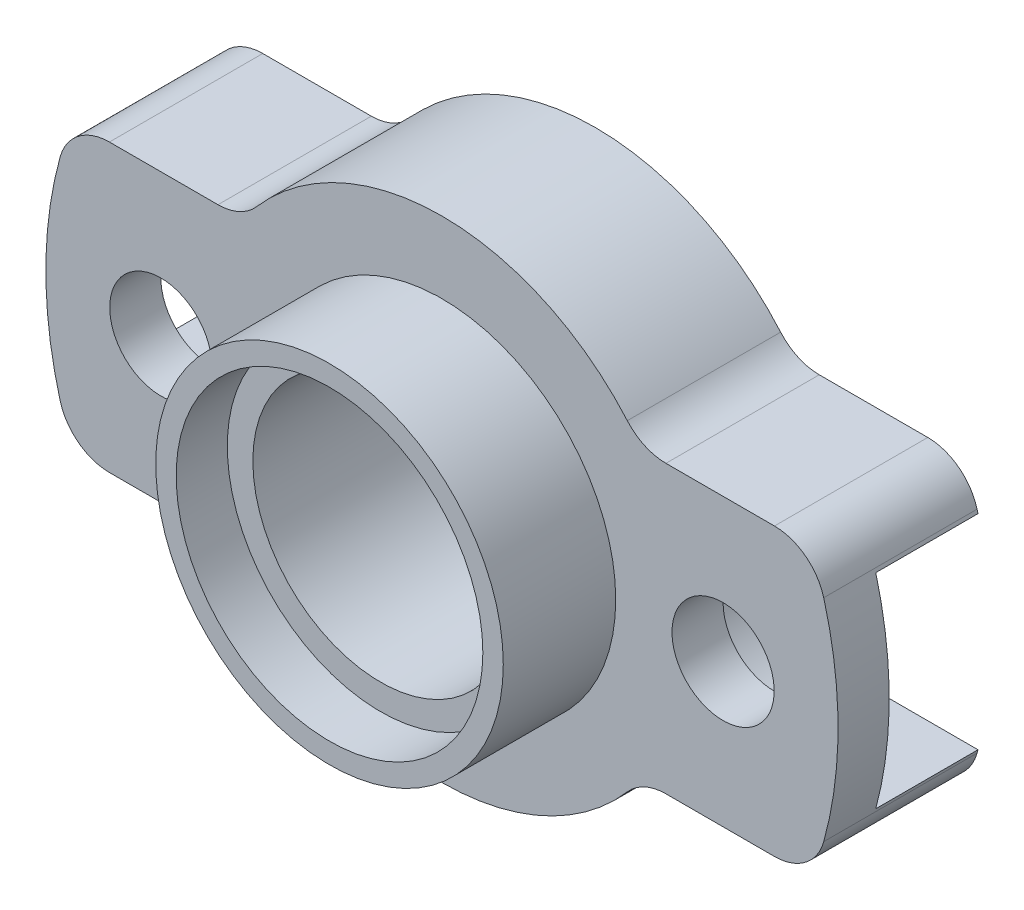
ISO-10303-21;
HEADER;
FILE_DESCRIPTION(('STEP AP214'),'2;1');
FILE_NAME('part.step','',(''),(''),'','','');
FILE_SCHEMA(('AUTOMOTIVE_DESIGN { 1 0 10303 214 1 1 1 1 }'));
ENDSEC;
DATA;
#1=APPLICATION_CONTEXT('core data for automotive mechanical design processes');
#2=APPLICATION_PROTOCOL_DEFINITION('international standard','automotive_design',2000,#1);
#3=PRODUCT_CONTEXT('',#1,'mechanical');
#4=PRODUCT('Part','Part','',(#3));
#5=PRODUCT_RELATED_PRODUCT_CATEGORY('part','',(#4));
#6=PRODUCT_DEFINITION_FORMATION('','',#4);
#7=PRODUCT_DEFINITION_CONTEXT('part definition',#1,'design');
#8=PRODUCT_DEFINITION('design','',#6,#7);
#9=PRODUCT_DEFINITION_SHAPE('','',#8);
#10=(LENGTH_UNIT() NAMED_UNIT(*) SI_UNIT(.MILLI.,.METRE.));
#11=(NAMED_UNIT(*) PLANE_ANGLE_UNIT() SI_UNIT($,.RADIAN.));
#12=(NAMED_UNIT(*) SI_UNIT($,.STERADIAN.) SOLID_ANGLE_UNIT());
#13=UNCERTAINTY_MEASURE_WITH_UNIT(LENGTH_MEASURE(1.E-05),#10,'distance_accuracy_value','');
#14=(GEOMETRIC_REPRESENTATION_CONTEXT(3) GLOBAL_UNCERTAINTY_ASSIGNED_CONTEXT((#13)) GLOBAL_UNIT_ASSIGNED_CONTEXT((#10,
#11,#12)) REPRESENTATION_CONTEXT('',''));
#15=CARTESIAN_POINT('',(0.,0.,0.));
#16=DIRECTION('',(0.,0.,1.));
#17=DIRECTION('',(1.,0.,0.));
#18=AXIS2_PLACEMENT_3D('',#15,#16,#17);
#19=CARTESIAN_POINT('',(0.,0.,3.));
#20=DIRECTION('',(0.,0.,-1.));
#21=DIRECTION('',(-1.,0.,0.));
#22=AXIS2_PLACEMENT_3D('',#19,#20,#21);
#23=CYLINDRICAL_SURFACE('',#22,2.5);
#24=CARTESIAN_POINT('',(0.,0.,0.));
#25=DIRECTION('',(0.,0.,1.));
#26=DIRECTION('',(1.,0.,0.));
#27=AXIS2_PLACEMENT_3D('',#24,#25,#26);
#28=CIRCLE('',#27,2.5);
#29=CARTESIAN_POINT('',(2.5,0.,0.));
#30=VERTEX_POINT('',#29);
#31=EDGE_CURVE('E309',#30,#30,#28,.T.);
#32=ORIENTED_EDGE('',*,*,#31,.F.);
#33=EDGE_LOOP('',(#32));
#34=FACE_BOUND('',#33,.T.);
#35=CARTESIAN_POINT('',(0.,0.,4.2));
#36=DIRECTION('',(0.,0.,1.));
#37=DIRECTION('',(1.,0.,0.));
#38=AXIS2_PLACEMENT_3D('',#35,#36,#37);
#39=CIRCLE('',#38,2.5);
#40=CARTESIAN_POINT('',(2.5,0.,4.2));
#41=VERTEX_POINT('',#40);
#42=EDGE_CURVE('E45',#41,#41,#39,.T.);
#43=ORIENTED_EDGE('',*,*,#42,.T.);
#44=EDGE_LOOP('',(#43));
#45=FACE_BOUND('',#44,.T.);
#46=ADVANCED_FACE('F41',(#34,#45),#23,.F.);
#47=CARTESIAN_POINT('',(5.5,0.,3.));
#48=DIRECTION('',(0.,0.,-1.));
#49=DIRECTION('',(-1.,0.,0.));
#50=AXIS2_PLACEMENT_3D('',#47,#48,#49);
#51=CYLINDRICAL_SURFACE('',#50,1.);
#52=CARTESIAN_POINT('',(5.5,0.,3.));
#53=DIRECTION('',(0.,0.,1.));
#54=DIRECTION('',(-1.,0.,0.));
#55=AXIS2_PLACEMENT_3D('',#52,#53,#54);
#56=CIRCLE('',#55,1.);
#57=CARTESIAN_POINT('',(4.5,0.,3.));
#58=VERTEX_POINT('',#57);
#59=EDGE_CURVE('E296',#58,#58,#56,.T.);
#60=ORIENTED_EDGE('',*,*,#59,.T.);
#61=EDGE_LOOP('',(#60));
#62=FACE_BOUND('',#61,.T.);
#63=CARTESIAN_POINT('',(5.5,0.,2.));
#64=DIRECTION('',(0.,0.,-1.));
#65=DIRECTION('',(-1.,0.,0.));
#66=AXIS2_PLACEMENT_3D('',#63,#64,#65);
#67=CIRCLE('',#66,1.);
#68=CARTESIAN_POINT('',(4.5,0.,2.));
#69=VERTEX_POINT('',#68);
#70=EDGE_CURVE('E251',#69,#69,#67,.T.);
#71=ORIENTED_EDGE('',*,*,#70,.T.);
#72=EDGE_LOOP('',(#71));
#73=FACE_BOUND('',#72,.T.);
#74=ADVANCED_FACE('F494',(#62,#73),#51,.F.);
#75=CARTESIAN_POINT('',(6.50557453266043,-1.8,3.));
#76=DIRECTION('',(0.,0.,1.));
#77=DIRECTION('',(1.,0.,0.));
#78=AXIS2_PLACEMENT_3D('',#75,#76,#77);
#79=PLANE('',#78);
#80=ORIENTED_EDGE('',*,*,#59,.F.);
#81=EDGE_LOOP('',(#80));
#82=FACE_BOUND('',#81,.T.);
#83=CARTESIAN_POINT('',(6.50557453266043,-1.8,3.));
#84=DIRECTION('',(0.,0.,1.));
#85=DIRECTION('',(1.,0.,0.));
#86=AXIS2_PLACEMENT_3D('',#83,#84,#85);
#87=CIRCLE('',#86,1.);
#88=CARTESIAN_POINT('',(6.50557453266043,-2.8,3.));
#89=VERTEX_POINT('',#88);
#90=CARTESIAN_POINT('',(7.46936335231383,-2.06666666666667,3.));
#91=VERTEX_POINT('',#90);
#92=EDGE_CURVE('E314',#89,#91,#87,.T.);
#93=ORIENTED_EDGE('',*,*,#92,.T.);
#94=CARTESIAN_POINT('',(0.,0.,3.));
#95=DIRECTION('',(0.,0.,1.));
#96=DIRECTION('',(1.,0.,0.));
#97=AXIS2_PLACEMENT_3D('',#94,#95,#96);
#98=CIRCLE('',#97,7.75);
#99=CARTESIAN_POINT('',(7.46936335231383,2.06666666666667,3.));
#100=VERTEX_POINT('',#99);
#101=EDGE_CURVE('E318',#91,#100,#98,.T.);
#102=ORIENTED_EDGE('',*,*,#101,.T.);
#103=CARTESIAN_POINT('',(6.50557453266043,1.8,3.));
#104=DIRECTION('',(0.,0.,1.));
#105=DIRECTION('',(-1.,0.,0.));
#106=AXIS2_PLACEMENT_3D('',#103,#104,#105);
#107=CIRCLE('',#106,1.);
#108=CARTESIAN_POINT('',(6.50557453266043,2.8,3.));
#109=VERTEX_POINT('',#108);
#110=EDGE_CURVE('E322',#100,#109,#107,.T.);
#111=ORIENTED_EDGE('',*,*,#110,.T.);
#112=DIRECTION('',(-1.,0.,0.));
#113=VECTOR('',#112,1.);
#114=CARTESIAN_POINT('',(6.50557453266043,2.8,3.));
#115=LINE('',#114,#113);
#116=CARTESIAN_POINT('',(4.38178046004133,2.8,3.));
#117=VERTEX_POINT('',#116);
#118=EDGE_CURVE('E325',#109,#117,#115,.T.);
#119=ORIENTED_EDGE('',*,*,#118,.T.);
#120=CARTESIAN_POINT('',(4.38178046004133,3.8,3.));
#121=DIRECTION('',(0.,0.,-1.));
#122=DIRECTION('',(-1.,0.,0.));
#123=AXIS2_PLACEMENT_3D('',#120,#121,#122);
#124=CIRCLE('',#123,1.);
#125=CARTESIAN_POINT('',(3.62630107037903,3.1448275862069,3.));
#126=VERTEX_POINT('',#125);
#127=EDGE_CURVE('E328',#117,#126,#124,.T.);
#128=ORIENTED_EDGE('',*,*,#127,.T.);
#129=CARTESIAN_POINT('',(0.,0.,3.));
#130=DIRECTION('',(0.,0.,1.));
#131=DIRECTION('',(1.,0.,0.));
#132=AXIS2_PLACEMENT_3D('',#129,#130,#131);
#133=CIRCLE('',#132,4.8);
#134=CARTESIAN_POINT('',(-3.62630107037903,3.1448275862069,3.));
#135=VERTEX_POINT('',#134);
#136=EDGE_CURVE('E331',#126,#135,#133,.T.);
#137=ORIENTED_EDGE('',*,*,#136,.T.);
#138=CARTESIAN_POINT('',(-4.38178046004133,3.8,3.));
#139=DIRECTION('',(0.,0.,-1.));
#140=DIRECTION('',(1.,0.,0.));
#141=AXIS2_PLACEMENT_3D('',#138,#139,#140);
#142=CIRCLE('',#141,1.);
#143=CARTESIAN_POINT('',(-4.38178046004133,2.8,3.));
#144=VERTEX_POINT('',#143);
#145=EDGE_CURVE('E334',#135,#144,#142,.T.);
#146=ORIENTED_EDGE('',*,*,#145,.T.);
#147=DIRECTION('',(-1.,0.,0.));
#148=VECTOR('',#147,1.);
#149=CARTESIAN_POINT('',(-6.50557453266043,2.8,3.));
#150=LINE('',#149,#148);
#151=CARTESIAN_POINT('',(-6.50557453266043,2.8,3.));
#152=VERTEX_POINT('',#151);
#153=EDGE_CURVE('E337',#144,#152,#150,.T.);
#154=ORIENTED_EDGE('',*,*,#153,.T.);
#155=CARTESIAN_POINT('',(-6.50557453266043,1.8,3.));
#156=DIRECTION('',(0.,0.,1.));
#157=DIRECTION('',(1.,0.,0.));
#158=AXIS2_PLACEMENT_3D('',#155,#156,#157);
#159=CIRCLE('',#158,1.);
#160=CARTESIAN_POINT('',(-7.46936335231383,2.06666666666667,3.));
#161=VERTEX_POINT('',#160);
#162=EDGE_CURVE('E340',#152,#161,#159,.T.);
#163=ORIENTED_EDGE('',*,*,#162,.T.);
#164=CARTESIAN_POINT('',(0.,0.,3.));
#165=DIRECTION('',(0.,0.,1.));
#166=DIRECTION('',(1.,0.,0.));
#167=AXIS2_PLACEMENT_3D('',#164,#165,#166);
#168=CIRCLE('',#167,7.75);
#169=CARTESIAN_POINT('',(-7.46936335231383,-2.06666666666667,3.));
#170=VERTEX_POINT('',#169);
#171=EDGE_CURVE('E343',#161,#170,#168,.T.);
#172=ORIENTED_EDGE('',*,*,#171,.T.);
#173=CARTESIAN_POINT('',(-6.50557453266043,-1.8,3.));
#174=DIRECTION('',(0.,0.,1.));
#175=DIRECTION('',(-1.,0.,0.));
#176=AXIS2_PLACEMENT_3D('',#173,#174,#175);
#177=CIRCLE('',#176,1.);
#178=CARTESIAN_POINT('',(-6.50557453266043,-2.8,3.));
#179=VERTEX_POINT('',#178);
#180=EDGE_CURVE('E346',#170,#179,#177,.T.);
#181=ORIENTED_EDGE('',*,*,#180,.T.);
#182=DIRECTION('',(1.,0.,0.));
#183=VECTOR('',#182,1.);
#184=CARTESIAN_POINT('',(-6.50557453266043,-2.8,3.));
#185=LINE('',#184,#183);
#186=CARTESIAN_POINT('',(-4.38178046004133,-2.8,3.));
#187=VERTEX_POINT('',#186);
#188=EDGE_CURVE('E349',#179,#187,#185,.T.);
#189=ORIENTED_EDGE('',*,*,#188,.T.);
#190=CARTESIAN_POINT('',(-4.38178046004133,-3.8,3.));
#191=DIRECTION('',(0.,0.,-1.));
#192=DIRECTION('',(-1.,0.,0.));
#193=AXIS2_PLACEMENT_3D('',#190,#191,#192);
#194=CIRCLE('',#193,1.);
#195=CARTESIAN_POINT('',(-3.62630107037903,-3.14482758620689,3.));
#196=VERTEX_POINT('',#195);
#197=EDGE_CURVE('E352',#187,#196,#194,.T.);
#198=ORIENTED_EDGE('',*,*,#197,.T.);
#199=CARTESIAN_POINT('',(0.,0.,3.));
#200=DIRECTION('',(0.,0.,1.));
#201=DIRECTION('',(1.,0.,0.));
#202=AXIS2_PLACEMENT_3D('',#199,#200,#201);
#203=CIRCLE('',#202,4.8);
#204=CARTESIAN_POINT('',(3.62630107037903,-3.1448275862069,3.));
#205=VERTEX_POINT('',#204);
#206=EDGE_CURVE('E355',#196,#205,#203,.T.);
#207=ORIENTED_EDGE('',*,*,#206,.T.);
#208=CARTESIAN_POINT('',(4.38178046004133,-3.8,3.));
#209=DIRECTION('',(0.,0.,-1.));
#210=DIRECTION('',(1.,0.,0.));
#211=AXIS2_PLACEMENT_3D('',#208,#209,#210);
#212=CIRCLE('',#211,1.);
#213=CARTESIAN_POINT('',(4.38178046004133,-2.8,3.));
#214=VERTEX_POINT('',#213);
#215=EDGE_CURVE('E358',#205,#214,#212,.T.);
#216=ORIENTED_EDGE('',*,*,#215,.T.);
#217=DIRECTION('',(1.,0.,0.));
#218=VECTOR('',#217,1.);
#219=CARTESIAN_POINT('',(6.50557453266043,-2.8,3.));
#220=LINE('',#219,#218);
#221=EDGE_CURVE('E361',#214,#89,#220,.T.);
#222=ORIENTED_EDGE('',*,*,#221,.T.);
#223=EDGE_LOOP('',(#93,#102,#111,#119,#128,#137,#146,#154,#163,#172,#181,#189,#198,#207,#216,#222));
#224=FACE_BOUND('',#223,.T.);
#225=CARTESIAN_POINT('',(-5.5,0.,3.));
#226=DIRECTION('',(0.,0.,1.));
#227=DIRECTION('',(1.,0.,0.));
#228=AXIS2_PLACEMENT_3D('',#225,#226,#227);
#229=CIRCLE('',#228,1.);
#230=CARTESIAN_POINT('',(-4.5,0.,3.));
#231=VERTEX_POINT('',#230);
#232=EDGE_CURVE('E305',#231,#231,#229,.T.);
#233=ORIENTED_EDGE('',*,*,#232,.F.);
#234=EDGE_LOOP('',(#233));
#235=FACE_BOUND('',#234,.T.);
#236=CARTESIAN_POINT('',(0.,0.,3.));
#237=DIRECTION('',(0.,0.,1.));
#238=DIRECTION('',(1.,0.,0.));
#239=AXIS2_PLACEMENT_3D('',#236,#237,#238);
#240=CIRCLE('',#239,3.4);
#241=CARTESIAN_POINT('',(3.4,0.,3.));
#242=VERTEX_POINT('',#241);
#243=EDGE_CURVE('E297',#242,#242,#240,.T.);
#244=ORIENTED_EDGE('',*,*,#243,.F.);
#245=EDGE_LOOP('',(#244));
#246=FACE_BOUND('',#245,.T.);
#247=ADVANCED_FACE('F490',(#82,#224,#235,#246),#79,.T.);
#248=CARTESIAN_POINT('',(6.50557453266043,-1.8,0.));
#249=DIRECTION('',(0.,0.,1.));
#250=DIRECTION('',(1.,0.,0.));
#251=AXIS2_PLACEMENT_3D('',#248,#249,#250);
#252=PLANE('',#251);
#253=CARTESIAN_POINT('',(5.5,0.,0.));
#254=DIRECTION('',(0.,0.,-1.));
#255=DIRECTION('',(-1.,0.,0.));
#256=AXIS2_PLACEMENT_3D('',#253,#254,#255);
#257=CIRCLE('',#256,2.);
#258=CARTESIAN_POINT('',(5.5,-2.,0.));
#259=VERTEX_POINT('',#258);
#260=CARTESIAN_POINT('',(5.5,2.,0.));
#261=VERTEX_POINT('',#260);
#262=EDGE_CURVE('E213',#259,#261,#257,.T.);
#263=ORIENTED_EDGE('',*,*,#262,.F.);
#264=DIRECTION('',(-1.,0.,0.));
#265=VECTOR('',#264,1.);
#266=CARTESIAN_POINT('',(5.5,-2.,0.));
#267=LINE('',#266,#265);
#268=CARTESIAN_POINT('',(7.48748956593597,-2.,0.));
#269=VERTEX_POINT('',#268);
#270=EDGE_CURVE('E229',#269,#259,#267,.T.);
#271=ORIENTED_EDGE('',*,*,#270,.F.);
#272=CARTESIAN_POINT('',(0.,0.,0.));
#273=DIRECTION('',(0.,0.,1.));
#274=DIRECTION('',(1.,0.,0.));
#275=AXIS2_PLACEMENT_3D('',#272,#273,#274);
#276=CIRCLE('',#275,7.75);
#277=CARTESIAN_POINT('',(7.46936335231383,-2.06666666666667,0.));
#278=VERTEX_POINT('',#277);
#279=EDGE_CURVE('E369',#278,#269,#276,.T.);
#280=ORIENTED_EDGE('',*,*,#279,.F.);
#281=CARTESIAN_POINT('',(6.50557453266043,-1.8,0.));
#282=DIRECTION('',(0.,0.,1.));
#283=DIRECTION('',(1.,0.,0.));
#284=AXIS2_PLACEMENT_3D('',#281,#282,#283);
#285=CIRCLE('',#284,1.);
#286=CARTESIAN_POINT('',(6.50557453266043,-2.8,0.));
#287=VERTEX_POINT('',#286);
#288=EDGE_CURVE('E313',#287,#278,#285,.T.);
#289=ORIENTED_EDGE('',*,*,#288,.F.);
#290=DIRECTION('',(1.,0.,0.));
#291=VECTOR('',#290,1.);
#292=CARTESIAN_POINT('',(6.50557453266043,-2.8,0.));
#293=LINE('',#292,#291);
#294=CARTESIAN_POINT('',(4.38178046004133,-2.8,0.));
#295=VERTEX_POINT('',#294);
#296=EDGE_CURVE('E319',#295,#287,#293,.T.);
#297=ORIENTED_EDGE('',*,*,#296,.F.);
#298=CARTESIAN_POINT('',(4.38178046004133,-3.8,0.));
#299=DIRECTION('',(0.,0.,-1.));
#300=DIRECTION('',(1.,0.,0.));
#301=AXIS2_PLACEMENT_3D('',#298,#299,#300);
#302=CIRCLE('',#301,1.);
#303=CARTESIAN_POINT('',(3.62630107037903,-3.1448275862069,0.));
#304=VERTEX_POINT('',#303);
#305=EDGE_CURVE('E411',#304,#295,#302,.T.);
#306=ORIENTED_EDGE('',*,*,#305,.F.);
#307=CARTESIAN_POINT('',(0.,0.,0.));
#308=DIRECTION('',(0.,0.,1.));
#309=DIRECTION('',(1.,0.,0.));
#310=AXIS2_PLACEMENT_3D('',#307,#308,#309);
#311=CIRCLE('',#310,4.8);
#312=CARTESIAN_POINT('',(-3.62630107037903,-3.14482758620689,0.));
#313=VERTEX_POINT('',#312);
#314=EDGE_CURVE('E408',#313,#304,#311,.T.);
#315=ORIENTED_EDGE('',*,*,#314,.F.);
#316=CARTESIAN_POINT('',(-4.38178046004133,-3.8,0.));
#317=DIRECTION('',(0.,0.,-1.));
#318=DIRECTION('',(-1.,0.,0.));
#319=AXIS2_PLACEMENT_3D('',#316,#317,#318);
#320=CIRCLE('',#319,1.);
#321=CARTESIAN_POINT('',(-4.38178046004133,-2.8,0.));
#322=VERTEX_POINT('',#321);
#323=EDGE_CURVE('E405',#322,#313,#320,.T.);
#324=ORIENTED_EDGE('',*,*,#323,.F.);
#325=DIRECTION('',(1.,0.,0.));
#326=VECTOR('',#325,1.);
#327=CARTESIAN_POINT('',(-6.50557453266043,-2.8,0.));
#328=LINE('',#327,#326);
#329=CARTESIAN_POINT('',(-6.50557453266043,-2.8,0.));
#330=VERTEX_POINT('',#329);
#331=EDGE_CURVE('E402',#330,#322,#328,.T.);
#332=ORIENTED_EDGE('',*,*,#331,.F.);
#333=CARTESIAN_POINT('',(-6.50557453266043,-1.8,0.));
#334=DIRECTION('',(0.,0.,1.));
#335=DIRECTION('',(-1.,0.,0.));
#336=AXIS2_PLACEMENT_3D('',#333,#334,#335);
#337=CIRCLE('',#336,1.);
#338=CARTESIAN_POINT('',(-7.46936335231383,-2.06666666666667,0.));
#339=VERTEX_POINT('',#338);
#340=EDGE_CURVE('E399',#339,#330,#337,.T.);
#341=ORIENTED_EDGE('',*,*,#340,.F.);
#342=CARTESIAN_POINT('',(0.,0.,0.));
#343=DIRECTION('',(0.,0.,1.));
#344=DIRECTION('',(1.,0.,0.));
#345=AXIS2_PLACEMENT_3D('',#342,#343,#344);
#346=CIRCLE('',#345,7.75);
#347=CARTESIAN_POINT('',(-7.48748956593597,-2.,0.));
#348=VERTEX_POINT('',#347);
#349=EDGE_CURVE('E394',#348,#339,#346,.T.);
#350=ORIENTED_EDGE('',*,*,#349,.F.);
#351=DIRECTION('',(-1.,0.,0.));
#352=VECTOR('',#351,1.);
#353=CARTESIAN_POINT('',(-5.5,-2.,0.));
#354=LINE('',#353,#352);
#355=CARTESIAN_POINT('',(-5.5,-2.,0.));
#356=VERTEX_POINT('',#355);
#357=EDGE_CURVE('E261',#356,#348,#354,.T.);
#358=ORIENTED_EDGE('',*,*,#357,.F.);
#359=CARTESIAN_POINT('',(-5.5,0.,0.));
#360=DIRECTION('',(0.,0.,-1.));
#361=DIRECTION('',(1.,0.,0.));
#362=AXIS2_PLACEMENT_3D('',#359,#360,#361);
#363=CIRCLE('',#362,2.);
#364=CARTESIAN_POINT('',(-5.5,2.,0.));
#365=VERTEX_POINT('',#364);
#366=EDGE_CURVE('E275',#365,#356,#363,.T.);
#367=ORIENTED_EDGE('',*,*,#366,.F.);
#368=DIRECTION('',(1.,0.,0.));
#369=VECTOR('',#368,1.);
#370=CARTESIAN_POINT('',(-5.5,2.,0.));
#371=LINE('',#370,#369);
#372=CARTESIAN_POINT('',(-7.48748956593597,2.,0.));
#373=VERTEX_POINT('',#372);
#374=EDGE_CURVE('E271',#373,#365,#371,.T.);
#375=ORIENTED_EDGE('',*,*,#374,.F.);
#376=CARTESIAN_POINT('',(-7.46936335231383,2.06666666666667,0.));
#377=VERTEX_POINT('',#376);
#378=EDGE_CURVE('E395',#377,#373,#346,.T.);
#379=ORIENTED_EDGE('',*,*,#378,.F.);
#380=CARTESIAN_POINT('',(-6.50557453266043,1.8,0.));
#381=DIRECTION('',(0.,0.,1.));
#382=DIRECTION('',(1.,0.,0.));
#383=AXIS2_PLACEMENT_3D('',#380,#381,#382);
#384=CIRCLE('',#383,1.);
#385=CARTESIAN_POINT('',(-6.50557453266043,2.8,0.));
#386=VERTEX_POINT('',#385);
#387=EDGE_CURVE('E391',#386,#377,#384,.T.);
#388=ORIENTED_EDGE('',*,*,#387,.F.);
#389=DIRECTION('',(-1.,0.,0.));
#390=VECTOR('',#389,1.);
#391=CARTESIAN_POINT('',(-6.50557453266043,2.8,0.));
#392=LINE('',#391,#390);
#393=CARTESIAN_POINT('',(-4.38178046004133,2.8,0.));
#394=VERTEX_POINT('',#393);
#395=EDGE_CURVE('E388',#394,#386,#392,.T.);
#396=ORIENTED_EDGE('',*,*,#395,.F.);
#397=CARTESIAN_POINT('',(-4.38178046004133,3.8,0.));
#398=DIRECTION('',(0.,0.,-1.));
#399=DIRECTION('',(1.,0.,0.));
#400=AXIS2_PLACEMENT_3D('',#397,#398,#399);
#401=CIRCLE('',#400,1.);
#402=CARTESIAN_POINT('',(-3.62630107037903,3.1448275862069,0.));
#403=VERTEX_POINT('',#402);
#404=EDGE_CURVE('E385',#403,#394,#401,.T.);
#405=ORIENTED_EDGE('',*,*,#404,.F.);
#406=CARTESIAN_POINT('',(0.,0.,0.));
#407=DIRECTION('',(0.,0.,1.));
#408=DIRECTION('',(1.,0.,0.));
#409=AXIS2_PLACEMENT_3D('',#406,#407,#408);
#410=CIRCLE('',#409,4.8);
#411=CARTESIAN_POINT('',(3.62630107037903,3.1448275862069,0.));
#412=VERTEX_POINT('',#411);
#413=EDGE_CURVE('E382',#412,#403,#410,.T.);
#414=ORIENTED_EDGE('',*,*,#413,.F.);
#415=CARTESIAN_POINT('',(4.38178046004133,3.8,0.));
#416=DIRECTION('',(0.,0.,-1.));
#417=DIRECTION('',(-1.,0.,0.));
#418=AXIS2_PLACEMENT_3D('',#415,#416,#417);
#419=CIRCLE('',#418,1.);
#420=CARTESIAN_POINT('',(4.38178046004133,2.8,0.));
#421=VERTEX_POINT('',#420);
#422=EDGE_CURVE('E379',#421,#412,#419,.T.);
#423=ORIENTED_EDGE('',*,*,#422,.F.);
#424=DIRECTION('',(-1.,0.,0.));
#425=VECTOR('',#424,1.);
#426=CARTESIAN_POINT('',(6.50557453266043,2.8,0.));
#427=LINE('',#426,#425);
#428=CARTESIAN_POINT('',(6.50557453266043,2.8,0.));
#429=VERTEX_POINT('',#428);
#430=EDGE_CURVE('E376',#429,#421,#427,.T.);
#431=ORIENTED_EDGE('',*,*,#430,.F.);
#432=CARTESIAN_POINT('',(6.50557453266043,1.8,0.));
#433=DIRECTION('',(0.,0.,1.));
#434=DIRECTION('',(-1.,0.,0.));
#435=AXIS2_PLACEMENT_3D('',#432,#433,#434);
#436=CIRCLE('',#435,1.);
#437=CARTESIAN_POINT('',(7.46936335231383,2.06666666666667,0.));
#438=VERTEX_POINT('',#437);
#439=EDGE_CURVE('E373',#438,#429,#436,.T.);
#440=ORIENTED_EDGE('',*,*,#439,.F.);
#441=CARTESIAN_POINT('',(7.48748956593597,2.,0.));
#442=VERTEX_POINT('',#441);
#443=EDGE_CURVE('E368',#442,#438,#276,.T.);
#444=ORIENTED_EDGE('',*,*,#443,.F.);
#445=DIRECTION('',(1.,0.,0.));
#446=VECTOR('',#445,1.);
#447=CARTESIAN_POINT('',(5.5,2.,0.));
#448=LINE('',#447,#446);
#449=EDGE_CURVE('E233',#261,#442,#448,.T.);
#450=ORIENTED_EDGE('',*,*,#449,.F.);
#451=EDGE_LOOP('',(#263,#271,#280,#289,#297,#306,#315,#324,#332,#341,#350,#358,#367,#375,#379,
#388,#396,#405,#414,#423,#431,#440,#444,#450));
#452=FACE_BOUND('',#451,.T.);
#453=ORIENTED_EDGE('',*,*,#31,.T.);
#454=EDGE_LOOP('',(#453));
#455=FACE_BOUND('',#454,.T.);
#456=ADVANCED_FACE('F493',(#452,#455),#252,.F.);
#457=CARTESIAN_POINT('',(6.50557453266043,-1.8,3.));
#458=DIRECTION('',(0.,0.,-1.));
#459=DIRECTION('',(-1.,0.,0.));
#460=AXIS2_PLACEMENT_3D('',#457,#458,#459);
#461=CYLINDRICAL_SURFACE('',#460,1.);
#462=ORIENTED_EDGE('',*,*,#288,.T.);
#463=DIRECTION('',(0.,0.,-1.));
#464=VECTOR('',#463,1.);
#465=CARTESIAN_POINT('',(7.46936335231383,-2.06666666666667,3.));
#466=LINE('',#465,#464);
#467=EDGE_CURVE('E11',#91,#278,#466,.T.);
#468=ORIENTED_EDGE('',*,*,#467,.F.);
#469=ORIENTED_EDGE('',*,*,#92,.F.);
#470=DIRECTION('',(0.,0.,-1.));
#471=VECTOR('',#470,1.);
#472=CARTESIAN_POINT('',(6.50557453266043,-2.8,3.));
#473=LINE('',#472,#471);
#474=EDGE_CURVE('E364',#89,#287,#473,.T.);
#475=ORIENTED_EDGE('',*,*,#474,.T.);
#476=EDGE_LOOP('',(#462,#468,#469,#475));
#477=FACE_BOUND('',#476,.T.);
#478=ADVANCED_FACE('F43',(#477),#461,.T.);
#479=CARTESIAN_POINT('',(0.,0.,3.));
#480=DIRECTION('',(0.,0.,-1.));
#481=DIRECTION('',(-1.,0.,0.));
#482=AXIS2_PLACEMENT_3D('',#479,#480,#481);
#483=CYLINDRICAL_SURFACE('',#482,7.75);
#484=ORIENTED_EDGE('',*,*,#279,.T.);
#485=DIRECTION('',(0.,0.,-1.));
#486=VECTOR('',#485,1.);
#487=CARTESIAN_POINT('',(7.48748956593597,-2.,2.));
#488=LINE('',#487,#486);
#489=CARTESIAN_POINT('',(7.48748956593597,-2.,2.));
#490=VERTEX_POINT('',#489);
#491=EDGE_CURVE('E252',#490,#269,#488,.T.);
#492=ORIENTED_EDGE('',*,*,#491,.F.);
#493=CARTESIAN_POINT('',(0.,0.,2.));
#494=DIRECTION('',(0.,0.,-1.));
#495=DIRECTION('',(-1.,0.,0.));
#496=AXIS2_PLACEMENT_3D('',#493,#494,#495);
#497=CIRCLE('',#496,7.75);
#498=CARTESIAN_POINT('',(7.48748956593597,2.,2.));
#499=VERTEX_POINT('',#498);
#500=EDGE_CURVE('E224',#499,#490,#497,.T.);
#501=ORIENTED_EDGE('',*,*,#500,.F.);
#502=DIRECTION('',(0.,0.,-1.));
#503=VECTOR('',#502,1.);
#504=CARTESIAN_POINT('',(7.48748956593597,2.,2.));
#505=LINE('',#504,#503);
#506=EDGE_CURVE('E217',#499,#442,#505,.T.);
#507=ORIENTED_EDGE('',*,*,#506,.T.);
#508=ORIENTED_EDGE('',*,*,#443,.T.);
#509=DIRECTION('',(0.,0.,-1.));
#510=VECTOR('',#509,1.);
#511=CARTESIAN_POINT('',(7.46936335231383,2.06666666666667,3.));
#512=LINE('',#511,#510);
#513=EDGE_CURVE('E51',#100,#438,#512,.T.);
#514=ORIENTED_EDGE('',*,*,#513,.F.);
#515=ORIENTED_EDGE('',*,*,#101,.F.);
#516=ORIENTED_EDGE('',*,*,#467,.T.);
#517=EDGE_LOOP('',(#484,#492,#501,#507,#508,#514,#515,#516));
#518=FACE_BOUND('',#517,.T.);
#519=ADVANCED_FACE('F579',(#518),#483,.T.);
#520=CARTESIAN_POINT('',(6.50557453266043,1.8,3.));
#521=DIRECTION('',(0.,0.,-1.));
#522=DIRECTION('',(-1.,0.,0.));
#523=AXIS2_PLACEMENT_3D('',#520,#521,#522);
#524=CYLINDRICAL_SURFACE('',#523,1.);
#525=ORIENTED_EDGE('',*,*,#439,.T.);
#526=DIRECTION('',(0.,0.,-1.));
#527=VECTOR('',#526,1.);
#528=CARTESIAN_POINT('',(6.50557453266043,2.8,3.));
#529=LINE('',#528,#527);
#530=EDGE_CURVE('E467',#109,#429,#529,.T.);
#531=ORIENTED_EDGE('',*,*,#530,.F.);
#532=ORIENTED_EDGE('',*,*,#110,.F.);
#533=ORIENTED_EDGE('',*,*,#513,.T.);
#534=EDGE_LOOP('',(#525,#531,#532,#533));
#535=FACE_BOUND('',#534,.T.);
#536=ADVANCED_FACE('F576',(#535),#524,.T.);
#537=CARTESIAN_POINT('',(6.50557453266043,2.8,3.));
#538=DIRECTION('',(0.,-1.,0.));
#539=DIRECTION('',(0.,0.,-1.));
#540=AXIS2_PLACEMENT_3D('',#537,#538,#539);
#541=PLANE('',#540);
#542=ORIENTED_EDGE('',*,*,#430,.T.);
#543=DIRECTION('',(0.,0.,-1.));
#544=VECTOR('',#543,1.);
#545=CARTESIAN_POINT('',(4.38178046004133,2.8,3.));
#546=LINE('',#545,#544);
#547=EDGE_CURVE('E463',#117,#421,#546,.T.);
#548=ORIENTED_EDGE('',*,*,#547,.F.);
#549=ORIENTED_EDGE('',*,*,#118,.F.);
#550=ORIENTED_EDGE('',*,*,#530,.T.);
#551=EDGE_LOOP('',(#542,#548,#549,#550));
#552=FACE_BOUND('',#551,.T.);
#553=ADVANCED_FACE('F572',(#552),#541,.F.);
#554=CARTESIAN_POINT('',(4.38178046004133,3.8,3.));
#555=DIRECTION('',(0.,0.,-1.));
#556=DIRECTION('',(-1.,0.,0.));
#557=AXIS2_PLACEMENT_3D('',#554,#555,#556);
#558=CYLINDRICAL_SURFACE('',#557,1.);
#559=ORIENTED_EDGE('',*,*,#422,.T.);
#560=DIRECTION('',(0.,0.,-1.));
#561=VECTOR('',#560,1.);
#562=CARTESIAN_POINT('',(3.62630107037903,3.1448275862069,3.));
#563=LINE('',#562,#561);
#564=EDGE_CURVE('E459',#126,#412,#563,.T.);
#565=ORIENTED_EDGE('',*,*,#564,.F.);
#566=ORIENTED_EDGE('',*,*,#127,.F.);
#567=ORIENTED_EDGE('',*,*,#547,.T.);
#568=EDGE_LOOP('',(#559,#565,#566,#567));
#569=FACE_BOUND('',#568,.T.);
#570=ADVANCED_FACE('F568',(#569),#558,.F.);
#571=CARTESIAN_POINT('',(0.,0.,3.));
#572=DIRECTION('',(0.,0.,-1.));
#573=DIRECTION('',(-1.,0.,0.));
#574=AXIS2_PLACEMENT_3D('',#571,#572,#573);
#575=CYLINDRICAL_SURFACE('',#574,4.8);
#576=ORIENTED_EDGE('',*,*,#413,.T.);
#577=DIRECTION('',(0.,0.,-1.));
#578=VECTOR('',#577,1.);
#579=CARTESIAN_POINT('',(-3.62630107037903,3.1448275862069,3.));
#580=LINE('',#579,#578);
#581=EDGE_CURVE('E455',#135,#403,#580,.T.);
#582=ORIENTED_EDGE('',*,*,#581,.F.);
#583=ORIENTED_EDGE('',*,*,#136,.F.);
#584=ORIENTED_EDGE('',*,*,#564,.T.);
#585=EDGE_LOOP('',(#576,#582,#583,#584));
#586=FACE_BOUND('',#585,.T.);
#587=ADVANCED_FACE('F564',(#586),#575,.T.);
#588=CARTESIAN_POINT('',(-4.38178046004133,3.8,3.));
#589=DIRECTION('',(0.,0.,-1.));
#590=DIRECTION('',(-1.,0.,0.));
#591=AXIS2_PLACEMENT_3D('',#588,#589,#590);
#592=CYLINDRICAL_SURFACE('',#591,1.);
#593=ORIENTED_EDGE('',*,*,#404,.T.);
#594=DIRECTION('',(0.,0.,-1.));
#595=VECTOR('',#594,1.);
#596=CARTESIAN_POINT('',(-4.38178046004133,2.8,3.));
#597=LINE('',#596,#595);
#598=EDGE_CURVE('E451',#144,#394,#597,.T.);
#599=ORIENTED_EDGE('',*,*,#598,.F.);
#600=ORIENTED_EDGE('',*,*,#145,.F.);
#601=ORIENTED_EDGE('',*,*,#581,.T.);
#602=EDGE_LOOP('',(#593,#599,#600,#601));
#603=FACE_BOUND('',#602,.T.);
#604=ADVANCED_FACE('F560',(#603),#592,.F.);
#605=CARTESIAN_POINT('',(-6.50557453266043,2.8,3.));
#606=DIRECTION('',(0.,-1.,0.));
#607=DIRECTION('',(0.,0.,-1.));
#608=AXIS2_PLACEMENT_3D('',#605,#606,#607);
#609=PLANE('',#608);
#610=ORIENTED_EDGE('',*,*,#395,.T.);
#611=DIRECTION('',(0.,0.,-1.));
#612=VECTOR('',#611,1.);
#613=CARTESIAN_POINT('',(-6.50557453266043,2.8,3.));
#614=LINE('',#613,#612);
#615=EDGE_CURVE('E447',#152,#386,#614,.T.);
#616=ORIENTED_EDGE('',*,*,#615,.F.);
#617=ORIENTED_EDGE('',*,*,#153,.F.);
#618=ORIENTED_EDGE('',*,*,#598,.T.);
#619=EDGE_LOOP('',(#610,#616,#617,#618));
#620=FACE_BOUND('',#619,.T.);
#621=ADVANCED_FACE('F556',(#620),#609,.F.);
#622=CARTESIAN_POINT('',(-6.50557453266043,1.8,3.));
#623=DIRECTION('',(0.,0.,-1.));
#624=DIRECTION('',(-1.,0.,0.));
#625=AXIS2_PLACEMENT_3D('',#622,#623,#624);
#626=CYLINDRICAL_SURFACE('',#625,1.);
#627=ORIENTED_EDGE('',*,*,#387,.T.);
#628=DIRECTION('',(0.,0.,-1.));
#629=VECTOR('',#628,1.);
#630=CARTESIAN_POINT('',(-7.46936335231383,2.06666666666667,3.));
#631=LINE('',#630,#629);
#632=EDGE_CURVE('E443',#161,#377,#631,.T.);
#633=ORIENTED_EDGE('',*,*,#632,.F.);
#634=ORIENTED_EDGE('',*,*,#162,.F.);
#635=ORIENTED_EDGE('',*,*,#615,.T.);
#636=EDGE_LOOP('',(#627,#633,#634,#635));
#637=FACE_BOUND('',#636,.T.);
#638=ADVANCED_FACE('F552',(#637),#626,.T.);
#639=CARTESIAN_POINT('',(0.,0.,3.));
#640=DIRECTION('',(0.,0.,-1.));
#641=DIRECTION('',(-1.,0.,0.));
#642=AXIS2_PLACEMENT_3D('',#639,#640,#641);
#643=CYLINDRICAL_SURFACE('',#642,7.75);
#644=CARTESIAN_POINT('',(0.,0.,2.));
#645=DIRECTION('',(0.,0.,-1.));
#646=DIRECTION('',(1.,0.,0.));
#647=AXIS2_PLACEMENT_3D('',#644,#645,#646);
#648=CIRCLE('',#647,7.75);
#649=CARTESIAN_POINT('',(-7.48748956593597,-2.,2.));
#650=VERTEX_POINT('',#649);
#651=CARTESIAN_POINT('',(-7.48748956593597,2.,2.));
#652=VERTEX_POINT('',#651);
#653=EDGE_CURVE('E257',#650,#652,#648,.T.);
#654=ORIENTED_EDGE('',*,*,#653,.F.);
#655=DIRECTION('',(0.,0.,-1.));
#656=VECTOR('',#655,1.);
#657=CARTESIAN_POINT('',(-7.48748956593597,-2.,2.));
#658=LINE('',#657,#656);
#659=EDGE_CURVE('E245',#650,#348,#658,.T.);
#660=ORIENTED_EDGE('',*,*,#659,.T.);
#661=ORIENTED_EDGE('',*,*,#349,.T.);
#662=DIRECTION('',(0.,0.,-1.));
#663=VECTOR('',#662,1.);
#664=CARTESIAN_POINT('',(-7.46936335231383,-2.06666666666667,3.));
#665=LINE('',#664,#663);
#666=EDGE_CURVE('E439',#170,#339,#665,.T.);
#667=ORIENTED_EDGE('',*,*,#666,.F.);
#668=ORIENTED_EDGE('',*,*,#171,.F.);
#669=ORIENTED_EDGE('',*,*,#632,.T.);
#670=ORIENTED_EDGE('',*,*,#378,.T.);
#671=DIRECTION('',(0.,0.,-1.));
#672=VECTOR('',#671,1.);
#673=CARTESIAN_POINT('',(-7.48748956593597,2.,2.));
#674=LINE('',#673,#672);
#675=EDGE_CURVE('E270',#652,#373,#674,.T.);
#676=ORIENTED_EDGE('',*,*,#675,.F.);
#677=EDGE_LOOP('',(#654,#660,#661,#667,#668,#669,#670,#676));
#678=FACE_BOUND('',#677,.T.);
#679=ADVANCED_FACE('F548',(#678),#643,.T.);
#680=CARTESIAN_POINT('',(-6.50557453266043,-1.8,3.));
#681=DIRECTION('',(0.,0.,-1.));
#682=DIRECTION('',(-1.,0.,0.));
#683=AXIS2_PLACEMENT_3D('',#680,#681,#682);
#684=CYLINDRICAL_SURFACE('',#683,1.);
#685=ORIENTED_EDGE('',*,*,#340,.T.);
#686=DIRECTION('',(0.,0.,-1.));
#687=VECTOR('',#686,1.);
#688=CARTESIAN_POINT('',(-6.50557453266043,-2.8,3.));
#689=LINE('',#688,#687);
#690=EDGE_CURVE('E435',#179,#330,#689,.T.);
#691=ORIENTED_EDGE('',*,*,#690,.F.);
#692=ORIENTED_EDGE('',*,*,#180,.F.);
#693=ORIENTED_EDGE('',*,*,#666,.T.);
#694=EDGE_LOOP('',(#685,#691,#692,#693));
#695=FACE_BOUND('',#694,.T.);
#696=ADVANCED_FACE('F544',(#695),#684,.T.);
#697=CARTESIAN_POINT('',(-6.50557453266043,-2.8,3.));
#698=DIRECTION('',(0.,1.,0.));
#699=DIRECTION('',(0.,0.,1.));
#700=AXIS2_PLACEMENT_3D('',#697,#698,#699);
#701=PLANE('',#700);
#702=ORIENTED_EDGE('',*,*,#331,.T.);
#703=DIRECTION('',(0.,0.,-1.));
#704=VECTOR('',#703,1.);
#705=CARTESIAN_POINT('',(-4.38178046004133,-2.8,3.));
#706=LINE('',#705,#704);
#707=EDGE_CURVE('E431',#187,#322,#706,.T.);
#708=ORIENTED_EDGE('',*,*,#707,.F.);
#709=ORIENTED_EDGE('',*,*,#188,.F.);
#710=ORIENTED_EDGE('',*,*,#690,.T.);
#711=EDGE_LOOP('',(#702,#708,#709,#710));
#712=FACE_BOUND('',#711,.T.);
#713=ADVANCED_FACE('F540',(#712),#701,.F.);
#714=CARTESIAN_POINT('',(-4.38178046004133,-3.8,3.));
#715=DIRECTION('',(0.,0.,-1.));
#716=DIRECTION('',(-1.,0.,0.));
#717=AXIS2_PLACEMENT_3D('',#714,#715,#716);
#718=CYLINDRICAL_SURFACE('',#717,1.);
#719=ORIENTED_EDGE('',*,*,#323,.T.);
#720=DIRECTION('',(0.,0.,-1.));
#721=VECTOR('',#720,1.);
#722=CARTESIAN_POINT('',(-3.62630107037903,-3.14482758620689,3.));
#723=LINE('',#722,#721);
#724=EDGE_CURVE('E427',#196,#313,#723,.T.);
#725=ORIENTED_EDGE('',*,*,#724,.F.);
#726=ORIENTED_EDGE('',*,*,#197,.F.);
#727=ORIENTED_EDGE('',*,*,#707,.T.);
#728=EDGE_LOOP('',(#719,#725,#726,#727));
#729=FACE_BOUND('',#728,.T.);
#730=ADVANCED_FACE('F536',(#729),#718,.F.);
#731=CARTESIAN_POINT('',(0.,0.,3.));
#732=DIRECTION('',(0.,0.,-1.));
#733=DIRECTION('',(-1.,0.,0.));
#734=AXIS2_PLACEMENT_3D('',#731,#732,#733);
#735=CYLINDRICAL_SURFACE('',#734,4.8);
#736=ORIENTED_EDGE('',*,*,#314,.T.);
#737=DIRECTION('',(0.,0.,-1.));
#738=VECTOR('',#737,1.);
#739=CARTESIAN_POINT('',(3.62630107037903,-3.1448275862069,3.));
#740=LINE('',#739,#738);
#741=EDGE_CURVE('E423',#205,#304,#740,.T.);
#742=ORIENTED_EDGE('',*,*,#741,.F.);
#743=ORIENTED_EDGE('',*,*,#206,.F.);
#744=ORIENTED_EDGE('',*,*,#724,.T.);
#745=EDGE_LOOP('',(#736,#742,#743,#744));
#746=FACE_BOUND('',#745,.T.);
#747=ADVANCED_FACE('F532',(#746),#735,.T.);
#748=CARTESIAN_POINT('',(4.38178046004133,-3.8,3.));
#749=DIRECTION('',(0.,0.,-1.));
#750=DIRECTION('',(-1.,0.,0.));
#751=AXIS2_PLACEMENT_3D('',#748,#749,#750);
#752=CYLINDRICAL_SURFACE('',#751,1.);
#753=ORIENTED_EDGE('',*,*,#305,.T.);
#754=DIRECTION('',(0.,0.,-1.));
#755=VECTOR('',#754,1.);
#756=CARTESIAN_POINT('',(4.38178046004133,-2.8,3.));
#757=LINE('',#756,#755);
#758=EDGE_CURVE('E419',#214,#295,#757,.T.);
#759=ORIENTED_EDGE('',*,*,#758,.F.);
#760=ORIENTED_EDGE('',*,*,#215,.F.);
#761=ORIENTED_EDGE('',*,*,#741,.T.);
#762=EDGE_LOOP('',(#753,#759,#760,#761));
#763=FACE_BOUND('',#762,.T.);
#764=ADVANCED_FACE('F528',(#763),#752,.F.);
#765=CARTESIAN_POINT('',(6.50557453266043,-2.8,3.));
#766=DIRECTION('',(0.,1.,0.));
#767=DIRECTION('',(0.,0.,1.));
#768=AXIS2_PLACEMENT_3D('',#765,#766,#767);
#769=PLANE('',#768);
#770=ORIENTED_EDGE('',*,*,#296,.T.);
#771=ORIENTED_EDGE('',*,*,#474,.F.);
#772=ORIENTED_EDGE('',*,*,#221,.F.);
#773=ORIENTED_EDGE('',*,*,#758,.T.);
#774=EDGE_LOOP('',(#770,#771,#772,#773));
#775=FACE_BOUND('',#774,.T.);
#776=ADVANCED_FACE('F486',(#775),#769,.F.);
#777=CARTESIAN_POINT('',(-5.5,0.,3.));
#778=DIRECTION('',(0.,0.,-1.));
#779=DIRECTION('',(-1.,0.,0.));
#780=AXIS2_PLACEMENT_3D('',#777,#778,#779);
#781=CYLINDRICAL_SURFACE('',#780,1.);
#782=CARTESIAN_POINT('',(-5.5,0.,2.));
#783=DIRECTION('',(0.,0.,1.));
#784=DIRECTION('',(1.,0.,0.));
#785=AXIS2_PLACEMENT_3D('',#782,#783,#784);
#786=CIRCLE('',#785,1.);
#787=CARTESIAN_POINT('',(-4.5,0.,2.));
#788=VERTEX_POINT('',#787);
#789=EDGE_CURVE('E301',#788,#788,#786,.T.);
#790=ORIENTED_EDGE('',*,*,#789,.F.);
#791=EDGE_LOOP('',(#790));
#792=FACE_BOUND('',#791,.T.);
#793=ORIENTED_EDGE('',*,*,#232,.T.);
#794=EDGE_LOOP('',(#793));
#795=FACE_BOUND('',#794,.T.);
#796=ADVANCED_FACE('F482',(#792,#795),#781,.F.);
#797=CARTESIAN_POINT('',(0.,0.,5.2));
#798=DIRECTION('',(0.,0.,1.));
#799=DIRECTION('',(1.,0.,0.));
#800=AXIS2_PLACEMENT_3D('',#797,#798,#799);
#801=PLANE('',#800);
#802=CARTESIAN_POINT('',(0.,0.,5.2));
#803=DIRECTION('',(0.,0.,1.));
#804=DIRECTION('',(1.,0.,0.));
#805=AXIS2_PLACEMENT_3D('',#802,#803,#804);
#806=CIRCLE('',#805,3.);
#807=CARTESIAN_POINT('',(3.,0.,5.2));
#808=VERTEX_POINT('',#807);
#809=EDGE_CURVE('E236',#808,#808,#806,.T.);
#810=ORIENTED_EDGE('',*,*,#809,.F.);
#811=EDGE_LOOP('',(#810));
#812=FACE_BOUND('',#811,.T.);
#813=CARTESIAN_POINT('',(0.,0.,5.2));
#814=DIRECTION('',(0.,0.,1.));
#815=DIRECTION('',(1.,0.,0.));
#816=AXIS2_PLACEMENT_3D('',#813,#814,#815);
#817=CIRCLE('',#816,3.4);
#818=CARTESIAN_POINT('',(3.4,0.,5.2));
#819=VERTEX_POINT('',#818);
#820=EDGE_CURVE('E292',#819,#819,#817,.T.);
#821=ORIENTED_EDGE('',*,*,#820,.T.);
#822=EDGE_LOOP('',(#821));
#823=FACE_BOUND('',#822,.T.);
#824=ADVANCED_FACE('F485',(#812,#823),#801,.T.);
#825=CARTESIAN_POINT('',(0.,0.,5.2));
#826=DIRECTION('',(0.,0.,-1.));
#827=DIRECTION('',(-1.,0.,0.));
#828=AXIS2_PLACEMENT_3D('',#825,#826,#827);
#829=CYLINDRICAL_SURFACE('',#828,3.4);
#830=ORIENTED_EDGE('',*,*,#820,.F.);
#831=EDGE_LOOP('',(#830));
#832=FACE_BOUND('',#831,.T.);
#833=ORIENTED_EDGE('',*,*,#243,.T.);
#834=EDGE_LOOP('',(#833));
#835=FACE_BOUND('',#834,.T.);
#836=ADVANCED_FACE('F499',(#832,#835),#829,.T.);
#837=CARTESIAN_POINT('',(5.5,0.,2.));
#838=DIRECTION('',(0.,0.,-1.));
#839=DIRECTION('',(-1.,0.,0.));
#840=AXIS2_PLACEMENT_3D('',#837,#838,#839);
#841=CYLINDRICAL_SURFACE('',#840,2.);
#842=ORIENTED_EDGE('',*,*,#262,.T.);
#843=DIRECTION('',(0.,0.,-1.));
#844=VECTOR('',#843,1.);
#845=CARTESIAN_POINT('',(5.5,2.,2.));
#846=LINE('',#845,#844);
#847=CARTESIAN_POINT('',(5.5,2.,2.));
#848=VERTEX_POINT('',#847);
#849=EDGE_CURVE('E208',#848,#261,#846,.T.);
#850=ORIENTED_EDGE('',*,*,#849,.F.);
#851=CARTESIAN_POINT('',(5.5,0.,2.));
#852=DIRECTION('',(0.,0.,-1.));
#853=DIRECTION('',(-1.,0.,0.));
#854=AXIS2_PLACEMENT_3D('',#851,#852,#853);
#855=CIRCLE('',#854,2.);
#856=CARTESIAN_POINT('',(5.5,-2.,2.));
#857=VERTEX_POINT('',#856);
#858=EDGE_CURVE('E210',#857,#848,#855,.T.);
#859=ORIENTED_EDGE('',*,*,#858,.F.);
#860=DIRECTION('',(0.,0.,-1.));
#861=VECTOR('',#860,1.);
#862=CARTESIAN_POINT('',(5.5,-2.,2.));
#863=LINE('',#862,#861);
#864=EDGE_CURVE('E248',#857,#259,#863,.T.);
#865=ORIENTED_EDGE('',*,*,#864,.T.);
#866=EDGE_LOOP('',(#842,#850,#859,#865));
#867=FACE_BOUND('',#866,.T.);
#868=ADVANCED_FACE('F209',(#867),#841,.F.);
#869=CARTESIAN_POINT('',(5.5,-2.,2.));
#870=DIRECTION('',(0.,-1.,0.));
#871=DIRECTION('',(0.,0.,-1.));
#872=AXIS2_PLACEMENT_3D('',#869,#870,#871);
#873=PLANE('',#872);
#874=ORIENTED_EDGE('',*,*,#270,.T.);
#875=ORIENTED_EDGE('',*,*,#864,.F.);
#876=DIRECTION('',(-1.,0.,0.));
#877=VECTOR('',#876,1.);
#878=CARTESIAN_POINT('',(5.5,-2.,2.));
#879=LINE('',#878,#877);
#880=EDGE_CURVE('E218',#490,#857,#879,.T.);
#881=ORIENTED_EDGE('',*,*,#880,.F.);
#882=ORIENTED_EDGE('',*,*,#491,.T.);
#883=EDGE_LOOP('',(#874,#875,#881,#882));
#884=FACE_BOUND('',#883,.T.);
#885=ADVANCED_FACE('F507',(#884),#873,.F.);
#886=CARTESIAN_POINT('',(5.5,2.,2.));
#887=DIRECTION('',(0.,1.,0.));
#888=DIRECTION('',(0.,0.,1.));
#889=AXIS2_PLACEMENT_3D('',#886,#887,#888);
#890=PLANE('',#889);
#891=ORIENTED_EDGE('',*,*,#449,.T.);
#892=ORIENTED_EDGE('',*,*,#506,.F.);
#893=DIRECTION('',(1.,0.,0.));
#894=VECTOR('',#893,1.);
#895=CARTESIAN_POINT('',(5.5,2.,2.));
#896=LINE('',#895,#894);
#897=EDGE_CURVE('E59',#848,#499,#896,.T.);
#898=ORIENTED_EDGE('',*,*,#897,.F.);
#899=ORIENTED_EDGE('',*,*,#849,.T.);
#900=EDGE_LOOP('',(#891,#892,#898,#899));
#901=FACE_BOUND('',#900,.T.);
#902=ADVANCED_FACE('F220',(#901),#890,.F.);
#903=CARTESIAN_POINT('',(5.5,0.,2.));
#904=DIRECTION('',(0.,0.,-1.));
#905=DIRECTION('',(-1.,0.,0.));
#906=AXIS2_PLACEMENT_3D('',#903,#904,#905);
#907=PLANE('',#906);
#908=ORIENTED_EDGE('',*,*,#70,.F.);
#909=EDGE_LOOP('',(#908));
#910=FACE_BOUND('',#909,.T.);
#911=ORIENTED_EDGE('',*,*,#858,.T.);
#912=ORIENTED_EDGE('',*,*,#897,.T.);
#913=ORIENTED_EDGE('',*,*,#500,.T.);
#914=ORIENTED_EDGE('',*,*,#880,.T.);
#915=EDGE_LOOP('',(#911,#912,#913,#914));
#916=FACE_BOUND('',#915,.T.);
#917=ADVANCED_FACE('F226',(#910,#916),#907,.T.);
#918=CARTESIAN_POINT('',(-5.5,-2.,2.));
#919=DIRECTION('',(0.,-1.,0.));
#920=DIRECTION('',(0.,0.,-1.));
#921=AXIS2_PLACEMENT_3D('',#918,#919,#920);
#922=PLANE('',#921);
#923=ORIENTED_EDGE('',*,*,#357,.T.);
#924=ORIENTED_EDGE('',*,*,#659,.F.);
#925=DIRECTION('',(-1.,0.,0.));
#926=VECTOR('',#925,1.);
#927=CARTESIAN_POINT('',(-5.5,-2.,2.));
#928=LINE('',#927,#926);
#929=CARTESIAN_POINT('',(-5.5,-2.,2.));
#930=VERTEX_POINT('',#929);
#931=EDGE_CURVE('E67',#930,#650,#928,.T.);
#932=ORIENTED_EDGE('',*,*,#931,.F.);
#933=DIRECTION('',(0.,0.,-1.));
#934=VECTOR('',#933,1.);
#935=CARTESIAN_POINT('',(-5.5,-2.,2.));
#936=LINE('',#935,#934);
#937=EDGE_CURVE('E284',#930,#356,#936,.T.);
#938=ORIENTED_EDGE('',*,*,#937,.T.);
#939=EDGE_LOOP('',(#923,#924,#932,#938));
#940=FACE_BOUND('',#939,.T.);
#941=ADVANCED_FACE('F607',(#940),#922,.F.);
#942=CARTESIAN_POINT('',(-5.5,0.,2.));
#943=DIRECTION('',(0.,0.,-1.));
#944=DIRECTION('',(-1.,0.,0.));
#945=AXIS2_PLACEMENT_3D('',#942,#943,#944);
#946=CYLINDRICAL_SURFACE('',#945,2.);
#947=ORIENTED_EDGE('',*,*,#366,.T.);
#948=ORIENTED_EDGE('',*,*,#937,.F.);
#949=CARTESIAN_POINT('',(-5.5,0.,2.));
#950=DIRECTION('',(0.,0.,-1.));
#951=DIRECTION('',(1.,0.,0.));
#952=AXIS2_PLACEMENT_3D('',#949,#950,#951);
#953=CIRCLE('',#952,2.);
#954=CARTESIAN_POINT('',(-5.5,2.,2.));
#955=VERTEX_POINT('',#954);
#956=EDGE_CURVE('E265',#955,#930,#953,.T.);
#957=ORIENTED_EDGE('',*,*,#956,.F.);
#958=DIRECTION('',(0.,0.,-1.));
#959=VECTOR('',#958,1.);
#960=CARTESIAN_POINT('',(-5.5,2.,2.));
#961=LINE('',#960,#959);
#962=EDGE_CURVE('E287',#955,#365,#961,.T.);
#963=ORIENTED_EDGE('',*,*,#962,.T.);
#964=EDGE_LOOP('',(#947,#948,#957,#963));
#965=FACE_BOUND('',#964,.T.);
#966=ADVANCED_FACE('F610',(#965),#946,.F.);
#967=CARTESIAN_POINT('',(-5.5,2.,2.));
#968=DIRECTION('',(0.,1.,0.));
#969=DIRECTION('',(0.,0.,1.));
#970=AXIS2_PLACEMENT_3D('',#967,#968,#969);
#971=PLANE('',#970);
#972=ORIENTED_EDGE('',*,*,#374,.T.);
#973=ORIENTED_EDGE('',*,*,#962,.F.);
#974=DIRECTION('',(1.,0.,0.));
#975=VECTOR('',#974,1.);
#976=CARTESIAN_POINT('',(-5.5,2.,2.));
#977=LINE('',#976,#975);
#978=EDGE_CURVE('E260',#652,#955,#977,.T.);
#979=ORIENTED_EDGE('',*,*,#978,.F.);
#980=ORIENTED_EDGE('',*,*,#675,.T.);
#981=EDGE_LOOP('',(#972,#973,#979,#980));
#982=FACE_BOUND('',#981,.T.);
#983=ADVANCED_FACE('F606',(#982),#971,.F.);
#984=CARTESIAN_POINT('',(0.,0.,2.));
#985=DIRECTION('',(0.,0.,1.));
#986=DIRECTION('',(1.,0.,0.));
#987=AXIS2_PLACEMENT_3D('',#984,#985,#986);
#988=PLANE('',#987);
#989=ORIENTED_EDGE('',*,*,#789,.T.);
#990=EDGE_LOOP('',(#989));
#991=FACE_BOUND('',#990,.T.);
#992=ORIENTED_EDGE('',*,*,#653,.T.);
#993=ORIENTED_EDGE('',*,*,#978,.T.);
#994=ORIENTED_EDGE('',*,*,#956,.T.);
#995=ORIENTED_EDGE('',*,*,#931,.T.);
#996=EDGE_LOOP('',(#992,#993,#994,#995));
#997=FACE_BOUND('',#996,.T.);
#998=ADVANCED_FACE('F480',(#991,#997),#988,.F.);
#999=CARTESIAN_POINT('',(0.,0.,4.2));
#1000=DIRECTION('',(0.,0.,1.));
#1001=DIRECTION('',(1.,0.,0.));
#1002=AXIS2_PLACEMENT_3D('',#999,#1000,#1001);
#1003=CYLINDRICAL_SURFACE('',#1002,3.);
#1004=CARTESIAN_POINT('',(0.,0.,4.2));
#1005=DIRECTION('',(0.,0.,1.));
#1006=DIRECTION('',(1.,0.,0.));
#1007=AXIS2_PLACEMENT_3D('',#1004,#1005,#1006);
#1008=CIRCLE('',#1007,3.);
#1009=CARTESIAN_POINT('',(3.,0.,4.2));
#1010=VERTEX_POINT('',#1009);
#1011=EDGE_CURVE('E879',#1010,#1010,#1008,.T.);
#1012=ORIENTED_EDGE('',*,*,#1011,.F.);
#1013=EDGE_LOOP('',(#1012));
#1014=FACE_BOUND('',#1013,.T.);
#1015=ORIENTED_EDGE('',*,*,#809,.T.);
#1016=EDGE_LOOP('',(#1015));
#1017=FACE_BOUND('',#1016,.T.);
#1018=ADVANCED_FACE('F605',(#1014,#1017),#1003,.F.);
#1019=CARTESIAN_POINT('',(0.,0.,4.2));
#1020=DIRECTION('',(0.,0.,1.));
#1021=DIRECTION('',(1.,0.,0.));
#1022=AXIS2_PLACEMENT_3D('',#1019,#1020,#1021);
#1023=PLANE('',#1022);
#1024=ORIENTED_EDGE('',*,*,#42,.F.);
#1025=EDGE_LOOP('',(#1024));
#1026=FACE_BOUND('',#1025,.T.);
#1027=ORIENTED_EDGE('',*,*,#1011,.T.);
#1028=EDGE_LOOP('',(#1027));
#1029=FACE_BOUND('',#1028,.T.);
#1030=ADVANCED_FACE('F685',(#1026,#1029),#1023,.T.);
#1031=CLOSED_SHELL('',(#46,#74,#247,#456,#478,#519,#536,#553,#570,#587,#604,#621,#638,#679,#696,
#713,#730,#747,#764,#776,#796,#824,#836,#868,#885,#902,#917,#941,#966,#983,#998,#1018,#1030));
#1032=MANIFOLD_SOLID_BREP('B2',#1031);
#1033=ADVANCED_BREP_SHAPE_REPRESENTATION('',(#18,#1032),#14);
#1034=SHAPE_DEFINITION_REPRESENTATION(#9,#1033);
ENDSEC;
END-ISO-10303-21;
